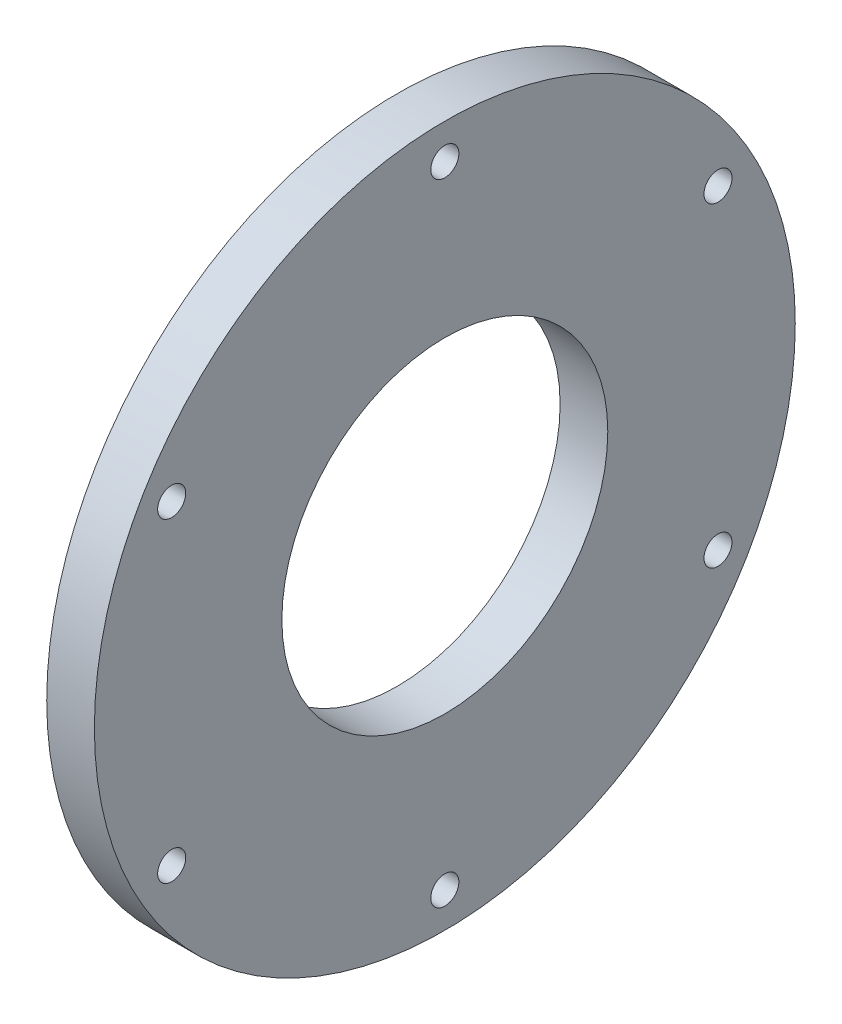
ISO-10303-21;
HEADER;
FILE_DESCRIPTION(('STEP AP214'),'2;1');
FILE_NAME('part.step','',(''),(''),'','','');
FILE_SCHEMA(('AUTOMOTIVE_DESIGN { 1 0 10303 214 1 1 1 1 }'));
ENDSEC;
DATA;
#1=APPLICATION_CONTEXT('core data for automotive mechanical design processes');
#2=APPLICATION_PROTOCOL_DEFINITION('international standard','automotive_design',2000,#1);
#3=PRODUCT_CONTEXT('',#1,'mechanical');
#4=PRODUCT('Part','Part','',(#3));
#5=PRODUCT_RELATED_PRODUCT_CATEGORY('part','',(#4));
#6=PRODUCT_DEFINITION_FORMATION('','',#4);
#7=PRODUCT_DEFINITION_CONTEXT('part definition',#1,'design');
#8=PRODUCT_DEFINITION('design','',#6,#7);
#9=PRODUCT_DEFINITION_SHAPE('','',#8);
#10=(LENGTH_UNIT() NAMED_UNIT(*) SI_UNIT(.MILLI.,.METRE.));
#11=(NAMED_UNIT(*) PLANE_ANGLE_UNIT() SI_UNIT($,.RADIAN.));
#12=(NAMED_UNIT(*) SI_UNIT($,.STERADIAN.) SOLID_ANGLE_UNIT());
#13=UNCERTAINTY_MEASURE_WITH_UNIT(LENGTH_MEASURE(1.E-05),#10,'distance_accuracy_value','');
#14=(GEOMETRIC_REPRESENTATION_CONTEXT(3) GLOBAL_UNCERTAINTY_ASSIGNED_CONTEXT((#13)) GLOBAL_UNIT_ASSIGNED_CONTEXT((#10,
#11,#12)) REPRESENTATION_CONTEXT('',''));
#15=CARTESIAN_POINT('',(0.,0.,0.));
#16=DIRECTION('',(0.,0.,1.));
#17=DIRECTION('',(1.,0.,0.));
#18=AXIS2_PLACEMENT_3D('',#15,#16,#17);
#19=CARTESIAN_POINT('',(13.6,0.,0.));
#20=DIRECTION('',(1.,0.,0.));
#21=DIRECTION('',(0.,0.,-1.));
#22=AXIS2_PLACEMENT_3D('',#19,#20,#21);
#23=PLANE('',#22);
#24=CARTESIAN_POINT('',(13.6,44.9999999999998,-77.9422863405996));
#25=DIRECTION('',(1.,0.,0.));
#26=DIRECTION('',(0.,0.,-1.));
#27=AXIS2_PLACEMENT_3D('',#24,#25,#26);
#28=CIRCLE('',#27,4.);
#29=CARTESIAN_POINT('',(13.6,44.9999999999998,-81.9422863405996));
#30=VERTEX_POINT('',#29);
#31=EDGE_CURVE('E35',#30,#30,#28,.T.);
#32=ORIENTED_EDGE('',*,*,#31,.F.);
#33=EDGE_LOOP('',(#32));
#34=FACE_BOUND('',#33,.T.);
#35=CARTESIAN_POINT('',(13.6,90.,0.));
#36=DIRECTION('',(1.,0.,0.));
#37=DIRECTION('',(0.,0.,-1.));
#38=AXIS2_PLACEMENT_3D('',#35,#36,#37);
#39=CIRCLE('',#38,4.);
#40=CARTESIAN_POINT('',(13.6,90.,-4.));
#41=VERTEX_POINT('',#40);
#42=EDGE_CURVE('E68',#41,#41,#39,.T.);
#43=ORIENTED_EDGE('',*,*,#42,.F.);
#44=EDGE_LOOP('',(#43));
#45=FACE_BOUND('',#44,.T.);
#46=CARTESIAN_POINT('',(13.6,44.9999999999998,77.9422863405996));
#47=DIRECTION('',(1.,0.,0.));
#48=DIRECTION('',(0.,0.,-1.));
#49=AXIS2_PLACEMENT_3D('',#46,#47,#48);
#50=CIRCLE('',#49,4.);
#51=CARTESIAN_POINT('',(13.6,44.9999999999998,73.9422863405996));
#52=VERTEX_POINT('',#51);
#53=EDGE_CURVE('E64',#52,#52,#50,.T.);
#54=ORIENTED_EDGE('',*,*,#53,.F.);
#55=EDGE_LOOP('',(#54));
#56=FACE_BOUND('',#55,.T.);
#57=CARTESIAN_POINT('',(13.6,-44.9999999999998,77.9422863405996));
#58=DIRECTION('',(1.,0.,0.));
#59=DIRECTION('',(0.,0.,-1.));
#60=AXIS2_PLACEMENT_3D('',#57,#58,#59);
#61=CIRCLE('',#60,4.);
#62=CARTESIAN_POINT('',(13.6,-44.9999999999998,73.9422863405996));
#63=VERTEX_POINT('',#62);
#64=EDGE_CURVE('E59',#63,#63,#61,.T.);
#65=ORIENTED_EDGE('',*,*,#64,.F.);
#66=EDGE_LOOP('',(#65));
#67=FACE_BOUND('',#66,.T.);
#68=CARTESIAN_POINT('',(13.6,-90.,0.));
#69=DIRECTION('',(1.,0.,0.));
#70=DIRECTION('',(0.,0.,-1.));
#71=AXIS2_PLACEMENT_3D('',#68,#69,#70);
#72=CIRCLE('',#71,4.);
#73=CARTESIAN_POINT('',(13.6,-90.,-4.00000000000002));
#74=VERTEX_POINT('',#73);
#75=EDGE_CURVE('E54',#74,#74,#72,.T.);
#76=ORIENTED_EDGE('',*,*,#75,.F.);
#77=EDGE_LOOP('',(#76));
#78=FACE_BOUND('',#77,.T.);
#79=CARTESIAN_POINT('',(13.6,-44.9999999999998,-77.9422863405996));
#80=DIRECTION('',(1.,0.,0.));
#81=DIRECTION('',(0.,0.,-1.));
#82=AXIS2_PLACEMENT_3D('',#79,#80,#81);
#83=CIRCLE('',#82,4.);
#84=CARTESIAN_POINT('',(13.6,-44.9999999999998,-81.9422863405996));
#85=VERTEX_POINT('',#84);
#86=EDGE_CURVE('E50',#85,#85,#83,.T.);
#87=ORIENTED_EDGE('',*,*,#86,.F.);
#88=EDGE_LOOP('',(#87));
#89=FACE_BOUND('',#88,.T.);
#90=CARTESIAN_POINT('',(13.6,0.,0.));
#91=DIRECTION('',(1.,0.,0.));
#92=DIRECTION('',(0.,0.,-1.));
#93=AXIS2_PLACEMENT_3D('',#90,#91,#92);
#94=CIRCLE('',#93,100.);
#95=CARTESIAN_POINT('',(13.6,0.,-100.));
#96=VERTEX_POINT('',#95);
#97=EDGE_CURVE('E10',#96,#96,#94,.T.);
#98=ORIENTED_EDGE('',*,*,#97,.T.);
#99=EDGE_LOOP('',(#98));
#100=FACE_BOUND('',#99,.T.);
#101=CARTESIAN_POINT('',(13.6,0.,0.));
#102=DIRECTION('',(1.,0.,0.));
#103=DIRECTION('',(0.,0.,-1.));
#104=AXIS2_PLACEMENT_3D('',#101,#102,#103);
#105=CIRCLE('',#104,46.5);
#106=CARTESIAN_POINT('',(13.6,0.,-46.5));
#107=VERTEX_POINT('',#106);
#108=EDGE_CURVE('E44',#107,#107,#105,.T.);
#109=ORIENTED_EDGE('',*,*,#108,.F.);
#110=EDGE_LOOP('',(#109));
#111=FACE_BOUND('',#110,.T.);
#112=ADVANCED_FACE('F31',(#34,#45,#56,#67,#78,#89,#100,#111),#23,.T.);
#113=CARTESIAN_POINT('',(0.,0.,0.));
#114=DIRECTION('',(1.,0.,0.));
#115=DIRECTION('',(0.,0.,-1.));
#116=AXIS2_PLACEMENT_3D('',#113,#114,#115);
#117=PLANE('',#116);
#118=CARTESIAN_POINT('',(0.,44.9999999999998,-77.9422863405996));
#119=DIRECTION('',(-1.,0.,0.));
#120=DIRECTION('',(0.,0.,1.));
#121=AXIS2_PLACEMENT_3D('',#118,#119,#120);
#122=CIRCLE('',#121,7.5);
#123=CARTESIAN_POINT('',(0.,44.9999999999998,-70.4422863405996));
#124=VERTEX_POINT('',#123);
#125=EDGE_CURVE('E236',#124,#124,#122,.T.);
#126=ORIENTED_EDGE('',*,*,#125,.F.);
#127=EDGE_LOOP('',(#126));
#128=FACE_BOUND('',#127,.T.);
#129=CARTESIAN_POINT('',(0.,90.,0.));
#130=DIRECTION('',(-1.,0.,0.));
#131=DIRECTION('',(0.,0.,1.));
#132=AXIS2_PLACEMENT_3D('',#129,#130,#131);
#133=CIRCLE('',#132,7.50000000000001);
#134=CARTESIAN_POINT('',(0.,90.,7.50000000000001));
#135=VERTEX_POINT('',#134);
#136=EDGE_CURVE('E83',#135,#135,#133,.T.);
#137=ORIENTED_EDGE('',*,*,#136,.F.);
#138=EDGE_LOOP('',(#137));
#139=FACE_BOUND('',#138,.T.);
#140=CARTESIAN_POINT('',(0.,44.9999999999998,77.9422863405996));
#141=DIRECTION('',(-1.,0.,0.));
#142=DIRECTION('',(0.,0.,1.));
#143=AXIS2_PLACEMENT_3D('',#140,#141,#142);
#144=CIRCLE('',#143,7.5);
#145=CARTESIAN_POINT('',(0.,44.9999999999998,85.4422863405996));
#146=VERTEX_POINT('',#145);
#147=EDGE_CURVE('E70',#146,#146,#144,.T.);
#148=ORIENTED_EDGE('',*,*,#147,.F.);
#149=EDGE_LOOP('',(#148));
#150=FACE_BOUND('',#149,.T.);
#151=CARTESIAN_POINT('',(0.,-44.9999999999998,77.9422863405996));
#152=DIRECTION('',(-1.,0.,0.));
#153=DIRECTION('',(0.,0.,1.));
#154=AXIS2_PLACEMENT_3D('',#151,#152,#153);
#155=CIRCLE('',#154,7.5);
#156=CARTESIAN_POINT('',(0.,-44.9999999999998,85.4422863405996));
#157=VERTEX_POINT('',#156);
#158=EDGE_CURVE('E66',#157,#157,#155,.T.);
#159=ORIENTED_EDGE('',*,*,#158,.F.);
#160=EDGE_LOOP('',(#159));
#161=FACE_BOUND('',#160,.T.);
#162=CARTESIAN_POINT('',(0.,-90.,0.));
#163=DIRECTION('',(-1.,0.,0.));
#164=DIRECTION('',(0.,0.,1.));
#165=AXIS2_PLACEMENT_3D('',#162,#163,#164);
#166=CIRCLE('',#165,7.50000000000001);
#167=CARTESIAN_POINT('',(0.,-90.,7.49999999999998));
#168=VERTEX_POINT('',#167);
#169=EDGE_CURVE('E62',#168,#168,#166,.T.);
#170=ORIENTED_EDGE('',*,*,#169,.F.);
#171=EDGE_LOOP('',(#170));
#172=FACE_BOUND('',#171,.T.);
#173=CARTESIAN_POINT('',(0.,-44.9999999999998,-77.9422863405996));
#174=DIRECTION('',(-1.,0.,0.));
#175=DIRECTION('',(0.,0.,1.));
#176=AXIS2_PLACEMENT_3D('',#173,#174,#175);
#177=CIRCLE('',#176,7.5);
#178=CARTESIAN_POINT('',(0.,-44.9999999999998,-70.4422863405996));
#179=VERTEX_POINT('',#178);
#180=EDGE_CURVE('E57',#179,#179,#177,.T.);
#181=ORIENTED_EDGE('',*,*,#180,.F.);
#182=EDGE_LOOP('',(#181));
#183=FACE_BOUND('',#182,.T.);
#184=CARTESIAN_POINT('',(0.,0.,0.));
#185=DIRECTION('',(1.,0.,0.));
#186=DIRECTION('',(0.,0.,-1.));
#187=AXIS2_PLACEMENT_3D('',#184,#185,#186);
#188=CIRCLE('',#187,100.);
#189=CARTESIAN_POINT('',(0.,0.,-100.));
#190=VERTEX_POINT('',#189);
#191=EDGE_CURVE('E39',#190,#190,#188,.T.);
#192=ORIENTED_EDGE('',*,*,#191,.F.);
#193=EDGE_LOOP('',(#192));
#194=FACE_BOUND('',#193,.T.);
#195=CARTESIAN_POINT('',(0.,0.,0.));
#196=DIRECTION('',(1.,0.,0.));
#197=DIRECTION('',(0.,0.,-1.));
#198=AXIS2_PLACEMENT_3D('',#195,#196,#197);
#199=CIRCLE('',#198,46.5);
#200=CARTESIAN_POINT('',(0.,0.,-46.5));
#201=VERTEX_POINT('',#200);
#202=EDGE_CURVE('E47',#201,#201,#199,.T.);
#203=ORIENTED_EDGE('',*,*,#202,.T.);
#204=EDGE_LOOP('',(#203));
#205=FACE_BOUND('',#204,.T.);
#206=ADVANCED_FACE('F117',(#128,#139,#150,#161,#172,#183,#194,#205),#117,.F.);
#207=CARTESIAN_POINT('',(13.6,0.,0.));
#208=DIRECTION('',(-1.,0.,0.));
#209=DIRECTION('',(0.,0.,1.));
#210=AXIS2_PLACEMENT_3D('',#207,#208,#209);
#211=CYLINDRICAL_SURFACE('',#210,100.);
#212=ORIENTED_EDGE('',*,*,#97,.F.);
#213=EDGE_LOOP('',(#212));
#214=FACE_BOUND('',#213,.T.);
#215=ORIENTED_EDGE('',*,*,#191,.T.);
#216=EDGE_LOOP('',(#215));
#217=FACE_BOUND('',#216,.T.);
#218=ADVANCED_FACE('F33',(#214,#217),#211,.T.);
#219=CARTESIAN_POINT('',(13.6,0.,0.));
#220=DIRECTION('',(-1.,0.,0.));
#221=DIRECTION('',(0.,0.,1.));
#222=AXIS2_PLACEMENT_3D('',#219,#220,#221);
#223=CYLINDRICAL_SURFACE('',#222,46.5);
#224=ORIENTED_EDGE('',*,*,#108,.T.);
#225=EDGE_LOOP('',(#224));
#226=FACE_BOUND('',#225,.T.);
#227=ORIENTED_EDGE('',*,*,#202,.F.);
#228=EDGE_LOOP('',(#227));
#229=FACE_BOUND('',#228,.T.);
#230=ADVANCED_FACE('F119',(#226,#229),#223,.F.);
#231=CARTESIAN_POINT('',(0.,-44.9999999999998,-77.9422863405996));
#232=DIRECTION('',(-1.,0.,0.));
#233=DIRECTION('',(0.,0.,1.));
#234=AXIS2_PLACEMENT_3D('',#231,#232,#233);
#235=CYLINDRICAL_SURFACE('',#234,4.);
#236=ORIENTED_EDGE('',*,*,#86,.T.);
#237=EDGE_LOOP('',(#236));
#238=FACE_BOUND('',#237,.T.);
#239=CARTESIAN_POINT('',(1.99999999999978,-44.9999999999998,-77.9422863405996));
#240=DIRECTION('',(-1.,0.,0.));
#241=DIRECTION('',(0.,0.,1.));
#242=AXIS2_PLACEMENT_3D('',#239,#240,#241);
#243=CIRCLE('',#242,4.);
#244=CARTESIAN_POINT('',(1.99999999999978,-44.9999999999998,-73.9422863405996));
#245=VERTEX_POINT('',#244);
#246=EDGE_CURVE('E53',#245,#245,#243,.T.);
#247=ORIENTED_EDGE('',*,*,#246,.T.);
#248=EDGE_LOOP('',(#247));
#249=FACE_BOUND('',#248,.T.);
#250=ADVANCED_FACE('F121',(#238,#249),#235,.F.);
#251=CARTESIAN_POINT('',(1.99999999999978,-40.9999999999998,-77.9422863405996));
#252=DIRECTION('',(1.,0.,0.));
#253=DIRECTION('',(0.,0.,-1.));
#254=AXIS2_PLACEMENT_3D('',#251,#252,#253);
#255=PLANE('',#254);
#256=ORIENTED_EDGE('',*,*,#246,.F.);
#257=EDGE_LOOP('',(#256));
#258=FACE_BOUND('',#257,.T.);
#259=CARTESIAN_POINT('',(1.99999999999978,-44.9999999999998,-77.9422863405996));
#260=DIRECTION('',(-1.,0.,0.));
#261=DIRECTION('',(0.,0.,1.));
#262=AXIS2_PLACEMENT_3D('',#259,#260,#261);
#263=CIRCLE('',#262,7.49999999999974);
#264=CARTESIAN_POINT('',(1.99999999999978,-44.9999999999998,-70.4422863405999));
#265=VERTEX_POINT('',#264);
#266=EDGE_CURVE('E107',#265,#265,#263,.T.);
#267=ORIENTED_EDGE('',*,*,#266,.T.);
#268=EDGE_LOOP('',(#267));
#269=FACE_BOUND('',#268,.T.);
#270=ADVANCED_FACE('F127',(#258,#269),#255,.F.);
#271=CARTESIAN_POINT('',(0.,-44.9999999999998,-77.9422863405996));
#272=DIRECTION('',(-1.,0.,0.));
#273=DIRECTION('',(0.,0.,1.));
#274=AXIS2_PLACEMENT_3D('',#271,#272,#273);
#275=CYLINDRICAL_SURFACE('',#274,7.49999999999987);
#276=ORIENTED_EDGE('',*,*,#266,.F.);
#277=EDGE_LOOP('',(#276));
#278=FACE_BOUND('',#277,.T.);
#279=ORIENTED_EDGE('',*,*,#180,.T.);
#280=EDGE_LOOP('',(#279));
#281=FACE_BOUND('',#280,.T.);
#282=ADVANCED_FACE('F155',(#278,#281),#275,.F.);
#283=CARTESIAN_POINT('',(0.,-90.,0.));
#284=DIRECTION('',(-1.,0.,0.));
#285=DIRECTION('',(0.,0.,1.));
#286=AXIS2_PLACEMENT_3D('',#283,#284,#285);
#287=CYLINDRICAL_SURFACE('',#286,4.);
#288=ORIENTED_EDGE('',*,*,#75,.T.);
#289=EDGE_LOOP('',(#288));
#290=FACE_BOUND('',#289,.T.);
#291=CARTESIAN_POINT('',(1.99999999999978,-90.,0.));
#292=DIRECTION('',(-1.,0.,0.));
#293=DIRECTION('',(0.,0.,1.));
#294=AXIS2_PLACEMENT_3D('',#291,#292,#293);
#295=CIRCLE('',#294,4.);
#296=CARTESIAN_POINT('',(1.99999999999978,-90.,3.99999999999998));
#297=VERTEX_POINT('',#296);
#298=EDGE_CURVE('E58',#297,#297,#295,.T.);
#299=ORIENTED_EDGE('',*,*,#298,.T.);
#300=EDGE_LOOP('',(#299));
#301=FACE_BOUND('',#300,.T.);
#302=ADVANCED_FACE('F161',(#290,#301),#287,.F.);
#303=CARTESIAN_POINT('',(1.99999999999978,-86.,0.));
#304=DIRECTION('',(1.,0.,0.));
#305=DIRECTION('',(0.,0.,-1.));
#306=AXIS2_PLACEMENT_3D('',#303,#304,#305);
#307=PLANE('',#306);
#308=ORIENTED_EDGE('',*,*,#298,.F.);
#309=EDGE_LOOP('',(#308));
#310=FACE_BOUND('',#309,.T.);
#311=CARTESIAN_POINT('',(1.99999999999978,-90.,0.));
#312=DIRECTION('',(-1.,0.,0.));
#313=DIRECTION('',(0.,0.,1.));
#314=AXIS2_PLACEMENT_3D('',#311,#312,#313);
#315=CIRCLE('',#314,7.49999999999974);
#316=CARTESIAN_POINT('',(1.99999999999978,-90.,7.49999999999972));
#317=VERTEX_POINT('',#316);
#318=EDGE_CURVE('E100',#317,#317,#315,.T.);
#319=ORIENTED_EDGE('',*,*,#318,.T.);
#320=EDGE_LOOP('',(#319));
#321=FACE_BOUND('',#320,.T.);
#322=ADVANCED_FACE('F171',(#310,#321),#307,.F.);
#323=CARTESIAN_POINT('',(0.,-90.,0.));
#324=DIRECTION('',(-1.,0.,0.));
#325=DIRECTION('',(0.,0.,1.));
#326=AXIS2_PLACEMENT_3D('',#323,#324,#325);
#327=CYLINDRICAL_SURFACE('',#326,7.49999999999987);
#328=ORIENTED_EDGE('',*,*,#318,.F.);
#329=EDGE_LOOP('',(#328));
#330=FACE_BOUND('',#329,.T.);
#331=ORIENTED_EDGE('',*,*,#169,.T.);
#332=EDGE_LOOP('',(#331));
#333=FACE_BOUND('',#332,.T.);
#334=ADVANCED_FACE('F177',(#330,#333),#327,.F.);
#335=CARTESIAN_POINT('',(0.,-44.9999999999998,77.9422863405996));
#336=DIRECTION('',(-1.,0.,0.));
#337=DIRECTION('',(0.,0.,1.));
#338=AXIS2_PLACEMENT_3D('',#335,#336,#337);
#339=CYLINDRICAL_SURFACE('',#338,4.);
#340=ORIENTED_EDGE('',*,*,#64,.T.);
#341=EDGE_LOOP('',(#340));
#342=FACE_BOUND('',#341,.T.);
#343=CARTESIAN_POINT('',(1.99999999999978,-44.9999999999998,77.9422863405996));
#344=DIRECTION('',(-1.,0.,0.));
#345=DIRECTION('',(0.,0.,1.));
#346=AXIS2_PLACEMENT_3D('',#343,#344,#345);
#347=CIRCLE('',#346,4.);
#348=CARTESIAN_POINT('',(1.99999999999978,-44.9999999999998,81.9422863405996));
#349=VERTEX_POINT('',#348);
#350=EDGE_CURVE('E63',#349,#349,#347,.T.);
#351=ORIENTED_EDGE('',*,*,#350,.T.);
#352=EDGE_LOOP('',(#351));
#353=FACE_BOUND('',#352,.T.);
#354=ADVANCED_FACE('F181',(#342,#353),#339,.F.);
#355=CARTESIAN_POINT('',(1.99999999999978,-40.9999999999998,77.9422863405996));
#356=DIRECTION('',(1.,0.,0.));
#357=DIRECTION('',(0.,0.,-1.));
#358=AXIS2_PLACEMENT_3D('',#355,#356,#357);
#359=PLANE('',#358);
#360=ORIENTED_EDGE('',*,*,#350,.F.);
#361=EDGE_LOOP('',(#360));
#362=FACE_BOUND('',#361,.T.);
#363=CARTESIAN_POINT('',(1.99999999999978,-44.9999999999998,77.9422863405996));
#364=DIRECTION('',(-1.,0.,0.));
#365=DIRECTION('',(0.,0.,1.));
#366=AXIS2_PLACEMENT_3D('',#363,#364,#365);
#367=CIRCLE('',#366,7.49999999999974);
#368=CARTESIAN_POINT('',(1.99999999999978,-44.9999999999998,85.4422863405994));
#369=VERTEX_POINT('',#368);
#370=EDGE_CURVE('E93',#369,#369,#367,.T.);
#371=ORIENTED_EDGE('',*,*,#370,.T.);
#372=EDGE_LOOP('',(#371));
#373=FACE_BOUND('',#372,.T.);
#374=ADVANCED_FACE('F185',(#362,#373),#359,.F.);
#375=CARTESIAN_POINT('',(0.,-44.9999999999998,77.9422863405996));
#376=DIRECTION('',(-1.,0.,0.));
#377=DIRECTION('',(0.,0.,1.));
#378=AXIS2_PLACEMENT_3D('',#375,#376,#377);
#379=CYLINDRICAL_SURFACE('',#378,7.49999999999987);
#380=ORIENTED_EDGE('',*,*,#370,.F.);
#381=EDGE_LOOP('',(#380));
#382=FACE_BOUND('',#381,.T.);
#383=ORIENTED_EDGE('',*,*,#158,.T.);
#384=EDGE_LOOP('',(#383));
#385=FACE_BOUND('',#384,.T.);
#386=ADVANCED_FACE('F189',(#382,#385),#379,.F.);
#387=CARTESIAN_POINT('',(0.,44.9999999999998,77.9422863405996));
#388=DIRECTION('',(-1.,0.,0.));
#389=DIRECTION('',(0.,0.,1.));
#390=AXIS2_PLACEMENT_3D('',#387,#388,#389);
#391=CYLINDRICAL_SURFACE('',#390,4.);
#392=ORIENTED_EDGE('',*,*,#53,.T.);
#393=EDGE_LOOP('',(#392));
#394=FACE_BOUND('',#393,.T.);
#395=CARTESIAN_POINT('',(1.99999999999978,44.9999999999998,77.9422863405996));
#396=DIRECTION('',(-1.,0.,0.));
#397=DIRECTION('',(0.,0.,1.));
#398=AXIS2_PLACEMENT_3D('',#395,#396,#397);
#399=CIRCLE('',#398,4.);
#400=CARTESIAN_POINT('',(1.99999999999978,44.9999999999998,81.9422863405996));
#401=VERTEX_POINT('',#400);
#402=EDGE_CURVE('E67',#401,#401,#399,.T.);
#403=ORIENTED_EDGE('',*,*,#402,.T.);
#404=EDGE_LOOP('',(#403));
#405=FACE_BOUND('',#404,.T.);
#406=ADVANCED_FACE('F193',(#394,#405),#391,.F.);
#407=CARTESIAN_POINT('',(1.99999999999978,48.9999999999998,77.9422863405996));
#408=DIRECTION('',(1.,0.,0.));
#409=DIRECTION('',(0.,0.,-1.));
#410=AXIS2_PLACEMENT_3D('',#407,#408,#409);
#411=PLANE('',#410);
#412=ORIENTED_EDGE('',*,*,#402,.F.);
#413=EDGE_LOOP('',(#412));
#414=FACE_BOUND('',#413,.T.);
#415=CARTESIAN_POINT('',(1.99999999999978,44.9999999999998,77.9422863405996));
#416=DIRECTION('',(-1.,0.,0.));
#417=DIRECTION('',(0.,0.,1.));
#418=AXIS2_PLACEMENT_3D('',#415,#416,#417);
#419=CIRCLE('',#418,7.49999999999974);
#420=CARTESIAN_POINT('',(1.99999999999978,44.9999999999998,85.4422863405994));
#421=VERTEX_POINT('',#420);
#422=EDGE_CURVE('E75',#421,#421,#419,.T.);
#423=ORIENTED_EDGE('',*,*,#422,.T.);
#424=EDGE_LOOP('',(#423));
#425=FACE_BOUND('',#424,.T.);
#426=ADVANCED_FACE('F197',(#414,#425),#411,.F.);
#427=CARTESIAN_POINT('',(0.,44.9999999999998,77.9422863405996));
#428=DIRECTION('',(-1.,0.,0.));
#429=DIRECTION('',(0.,0.,1.));
#430=AXIS2_PLACEMENT_3D('',#427,#428,#429);
#431=CYLINDRICAL_SURFACE('',#430,7.49999999999987);
#432=ORIENTED_EDGE('',*,*,#422,.F.);
#433=EDGE_LOOP('',(#432));
#434=FACE_BOUND('',#433,.T.);
#435=ORIENTED_EDGE('',*,*,#147,.T.);
#436=EDGE_LOOP('',(#435));
#437=FACE_BOUND('',#436,.T.);
#438=ADVANCED_FACE('F201',(#434,#437),#431,.F.);
#439=CARTESIAN_POINT('',(0.,90.,0.));
#440=DIRECTION('',(-1.,0.,0.));
#441=DIRECTION('',(0.,0.,1.));
#442=AXIS2_PLACEMENT_3D('',#439,#440,#441);
#443=CYLINDRICAL_SURFACE('',#442,4.);
#444=ORIENTED_EDGE('',*,*,#42,.T.);
#445=EDGE_LOOP('',(#444));
#446=FACE_BOUND('',#445,.T.);
#447=CARTESIAN_POINT('',(1.99999999999978,90.,0.));
#448=DIRECTION('',(-1.,0.,0.));
#449=DIRECTION('',(0.,0.,1.));
#450=AXIS2_PLACEMENT_3D('',#447,#448,#449);
#451=CIRCLE('',#450,4.);
#452=CARTESIAN_POINT('',(1.99999999999978,90.,4.));
#453=VERTEX_POINT('',#452);
#454=EDGE_CURVE('E71',#453,#453,#451,.T.);
#455=ORIENTED_EDGE('',*,*,#454,.T.);
#456=EDGE_LOOP('',(#455));
#457=FACE_BOUND('',#456,.T.);
#458=ADVANCED_FACE('F205',(#446,#457),#443,.F.);
#459=CARTESIAN_POINT('',(1.99999999999978,94.,0.));
#460=DIRECTION('',(1.,0.,0.));
#461=DIRECTION('',(0.,0.,-1.));
#462=AXIS2_PLACEMENT_3D('',#459,#460,#461);
#463=PLANE('',#462);
#464=ORIENTED_EDGE('',*,*,#454,.F.);
#465=EDGE_LOOP('',(#464));
#466=FACE_BOUND('',#465,.T.);
#467=CARTESIAN_POINT('',(1.99999999999978,90.,0.));
#468=DIRECTION('',(-1.,0.,0.));
#469=DIRECTION('',(0.,0.,1.));
#470=AXIS2_PLACEMENT_3D('',#467,#468,#469);
#471=CIRCLE('',#470,7.49999999999974);
#472=CARTESIAN_POINT('',(1.99999999999978,90.,7.49999999999974));
#473=VERTEX_POINT('',#472);
#474=EDGE_CURVE('E78',#473,#473,#471,.T.);
#475=ORIENTED_EDGE('',*,*,#474,.T.);
#476=EDGE_LOOP('',(#475));
#477=FACE_BOUND('',#476,.T.);
#478=ADVANCED_FACE('F209',(#466,#477),#463,.F.);
#479=CARTESIAN_POINT('',(0.,90.,0.));
#480=DIRECTION('',(-1.,0.,0.));
#481=DIRECTION('',(0.,0.,1.));
#482=AXIS2_PLACEMENT_3D('',#479,#480,#481);
#483=CYLINDRICAL_SURFACE('',#482,7.49999999999987);
#484=ORIENTED_EDGE('',*,*,#474,.F.);
#485=EDGE_LOOP('',(#484));
#486=FACE_BOUND('',#485,.T.);
#487=ORIENTED_EDGE('',*,*,#136,.T.);
#488=EDGE_LOOP('',(#487));
#489=FACE_BOUND('',#488,.T.);
#490=ADVANCED_FACE('F212',(#486,#489),#483,.F.);
#491=CARTESIAN_POINT('',(0.,44.9999999999998,-77.9422863405996));
#492=DIRECTION('',(-1.,0.,0.));
#493=DIRECTION('',(0.,0.,1.));
#494=AXIS2_PLACEMENT_3D('',#491,#492,#493);
#495=CYLINDRICAL_SURFACE('',#494,4.);
#496=ORIENTED_EDGE('',*,*,#31,.T.);
#497=EDGE_LOOP('',(#496));
#498=FACE_BOUND('',#497,.T.);
#499=CARTESIAN_POINT('',(1.99999999999978,44.9999999999998,-77.9422863405996));
#500=DIRECTION('',(-1.,0.,0.));
#501=DIRECTION('',(0.,0.,1.));
#502=AXIS2_PLACEMENT_3D('',#499,#500,#501);
#503=CIRCLE('',#502,4.);
#504=CARTESIAN_POINT('',(1.99999999999978,44.9999999999998,-73.9422863405996));
#505=VERTEX_POINT('',#504);
#506=EDGE_CURVE('E238',#505,#505,#503,.T.);
#507=ORIENTED_EDGE('',*,*,#506,.T.);
#508=EDGE_LOOP('',(#507));
#509=FACE_BOUND('',#508,.T.);
#510=ADVANCED_FACE('F216',(#498,#509),#495,.F.);
#511=CARTESIAN_POINT('',(1.99999999999978,48.9999999999998,-77.9422863405996));
#512=DIRECTION('',(1.,0.,0.));
#513=DIRECTION('',(0.,0.,-1.));
#514=AXIS2_PLACEMENT_3D('',#511,#512,#513);
#515=PLANE('',#514);
#516=ORIENTED_EDGE('',*,*,#506,.F.);
#517=EDGE_LOOP('',(#516));
#518=FACE_BOUND('',#517,.T.);
#519=CARTESIAN_POINT('',(1.99999999999978,44.9999999999998,-77.9422863405996));
#520=DIRECTION('',(-1.,0.,0.));
#521=DIRECTION('',(0.,0.,1.));
#522=AXIS2_PLACEMENT_3D('',#519,#520,#521);
#523=CIRCLE('',#522,7.49999999999974);
#524=CARTESIAN_POINT('',(1.99999999999978,44.9999999999998,-70.4422863405998));
#525=VERTEX_POINT('',#524);
#526=EDGE_CURVE('E233',#525,#525,#523,.T.);
#527=ORIENTED_EDGE('',*,*,#526,.T.);
#528=EDGE_LOOP('',(#527));
#529=FACE_BOUND('',#528,.T.);
#530=ADVANCED_FACE('F220',(#518,#529),#515,.F.);
#531=CARTESIAN_POINT('',(0.,44.9999999999998,-77.9422863405996));
#532=DIRECTION('',(-1.,0.,0.));
#533=DIRECTION('',(0.,0.,1.));
#534=AXIS2_PLACEMENT_3D('',#531,#532,#533);
#535=CYLINDRICAL_SURFACE('',#534,7.49999999999987);
#536=ORIENTED_EDGE('',*,*,#526,.F.);
#537=EDGE_LOOP('',(#536));
#538=FACE_BOUND('',#537,.T.);
#539=ORIENTED_EDGE('',*,*,#125,.T.);
#540=EDGE_LOOP('',(#539));
#541=FACE_BOUND('',#540,.T.);
#542=ADVANCED_FACE('F224',(#538,#541),#535,.F.);
#543=CLOSED_SHELL('',(#112,#206,#218,#230,#250,#270,#282,#302,#322,#334,#354,#374,#386,#406,
#426,#438,#458,#478,#490,#510,#530,#542));
#544=MANIFOLD_SOLID_BREP('B2',#543);
#545=ADVANCED_BREP_SHAPE_REPRESENTATION('',(#18,#544),#14);
#546=SHAPE_DEFINITION_REPRESENTATION(#9,#545);
ENDSEC;
END-ISO-10303-21;
